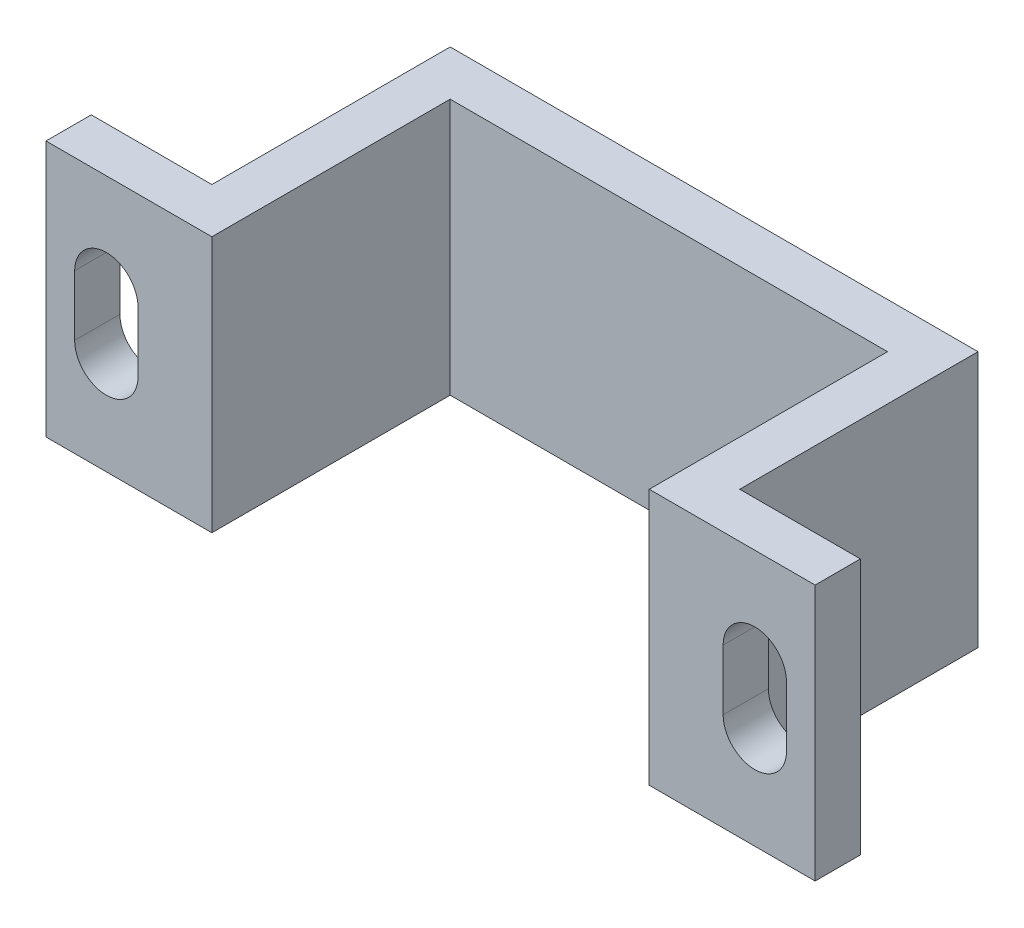
ISO-10303-21;
HEADER;
FILE_DESCRIPTION(('STEP AP214'),'2;1');
FILE_NAME('part.step','',(''),(''),'','','');
FILE_SCHEMA(('AUTOMOTIVE_DESIGN { 1 0 10303 214 1 1 1 1 }'));
ENDSEC;
DATA;
#1=APPLICATION_CONTEXT('core data for automotive mechanical design processes');
#2=APPLICATION_PROTOCOL_DEFINITION('international standard','automotive_design',2000,#1);
#3=PRODUCT_CONTEXT('',#1,'mechanical');
#4=PRODUCT('Part','Part','',(#3));
#5=PRODUCT_RELATED_PRODUCT_CATEGORY('part','',(#4));
#6=PRODUCT_DEFINITION_FORMATION('','',#4);
#7=PRODUCT_DEFINITION_CONTEXT('part definition',#1,'design');
#8=PRODUCT_DEFINITION('design','',#6,#7);
#9=PRODUCT_DEFINITION_SHAPE('','',#8);
#10=(LENGTH_UNIT() NAMED_UNIT(*) SI_UNIT(.MILLI.,.METRE.));
#11=(NAMED_UNIT(*) PLANE_ANGLE_UNIT() SI_UNIT($,.RADIAN.));
#12=(NAMED_UNIT(*) SI_UNIT($,.STERADIAN.) SOLID_ANGLE_UNIT());
#13=UNCERTAINTY_MEASURE_WITH_UNIT(LENGTH_MEASURE(1.E-05),#10,'distance_accuracy_value','');
#14=(GEOMETRIC_REPRESENTATION_CONTEXT(3) GLOBAL_UNCERTAINTY_ASSIGNED_CONTEXT((#13)) GLOBAL_UNIT_ASSIGNED_CONTEXT((#10,
#11,#12)) REPRESENTATION_CONTEXT('',''));
#15=CARTESIAN_POINT('',(0.,0.,0.));
#16=DIRECTION('',(0.,0.,1.));
#17=DIRECTION('',(1.,0.,0.));
#18=AXIS2_PLACEMENT_3D('',#15,#16,#17);
#19=CARTESIAN_POINT('',(54.61,21.59,-3.81));
#20=DIRECTION('',(0.,0.,-1.));
#21=DIRECTION('',(-1.,0.,0.));
#22=AXIS2_PLACEMENT_3D('',#19,#20,#21);
#23=PLANE('',#22);
#24=DIRECTION('',(1.,0.,0.));
#25=VECTOR('',#24,1.);
#26=CARTESIAN_POINT('',(54.61,0.,-3.81));
#27=LINE('',#26,#25);
#28=CARTESIAN_POINT('',(54.61,0.,-3.81));
#29=VERTEX_POINT('',#28);
#30=CARTESIAN_POINT('',(64.77,0.,-3.81));
#31=VERTEX_POINT('',#30);
#32=EDGE_CURVE('E255',#29,#31,#27,.T.);
#33=ORIENTED_EDGE('',*,*,#32,.F.);
#34=DIRECTION('',(0.,-1.,0.));
#35=VECTOR('',#34,1.);
#36=CARTESIAN_POINT('',(54.61,21.59,-3.81));
#37=LINE('',#36,#35);
#38=CARTESIAN_POINT('',(54.61,21.59,-3.81));
#39=VERTEX_POINT('',#38);
#40=EDGE_CURVE('E283',#39,#29,#37,.T.);
#41=ORIENTED_EDGE('',*,*,#40,.F.);
#42=DIRECTION('',(1.,0.,0.));
#43=VECTOR('',#42,1.);
#44=CARTESIAN_POINT('',(54.61,21.59,-3.81));
#45=LINE('',#44,#43);
#46=CARTESIAN_POINT('',(64.77,21.59,-3.81));
#47=VERTEX_POINT('',#46);
#48=EDGE_CURVE('E234',#39,#47,#45,.T.);
#49=ORIENTED_EDGE('',*,*,#48,.T.);
#50=DIRECTION('',(0.,-1.,0.));
#51=VECTOR('',#50,1.);
#52=CARTESIAN_POINT('',(64.77,21.59,-3.81));
#53=LINE('',#52,#51);
#54=EDGE_CURVE('E286',#47,#31,#53,.T.);
#55=ORIENTED_EDGE('',*,*,#54,.T.);
#56=EDGE_LOOP('',(#33,#41,#49,#55));
#57=FACE_BOUND('',#56,.T.);
#58=DIRECTION('',(0.,1.,0.));
#59=VECTOR('',#58,1.);
#60=CARTESIAN_POINT('',(62.357,13.335,-3.81));
#61=LINE('',#60,#59);
#62=CARTESIAN_POINT('',(62.357,8.255,-3.81));
#63=VERTEX_POINT('',#62);
#64=CARTESIAN_POINT('',(62.357,13.335,-3.81));
#65=VERTEX_POINT('',#64);
#66=EDGE_CURVE('E209',#63,#65,#61,.T.);
#67=ORIENTED_EDGE('',*,*,#66,.T.);
#68=CARTESIAN_POINT('',(59.69,13.335,-3.81));
#69=DIRECTION('',(0.,0.,1.));
#70=DIRECTION('',(1.,0.,0.));
#71=AXIS2_PLACEMENT_3D('',#68,#69,#70);
#72=CIRCLE('',#71,2.667);
#73=CARTESIAN_POINT('',(57.023,13.335,-3.81));
#74=VERTEX_POINT('',#73);
#75=EDGE_CURVE('E61',#65,#74,#72,.T.);
#76=ORIENTED_EDGE('',*,*,#75,.T.);
#77=DIRECTION('',(0.,-1.,0.));
#78=VECTOR('',#77,1.);
#79=CARTESIAN_POINT('',(57.023,13.335,-3.81));
#80=LINE('',#79,#78);
#81=CARTESIAN_POINT('',(57.023,8.255,-3.81));
#82=VERTEX_POINT('',#81);
#83=EDGE_CURVE('E192',#74,#82,#80,.T.);
#84=ORIENTED_EDGE('',*,*,#83,.T.);
#85=CARTESIAN_POINT('',(59.69,8.255,-3.81));
#86=DIRECTION('',(0.,0.,1.));
#87=DIRECTION('',(1.,0.,0.));
#88=AXIS2_PLACEMENT_3D('',#85,#86,#87);
#89=CIRCLE('',#88,2.667);
#90=EDGE_CURVE('E216',#82,#63,#89,.T.);
#91=ORIENTED_EDGE('',*,*,#90,.T.);
#92=EDGE_LOOP('',(#67,#76,#84,#91));
#93=FACE_BOUND('',#92,.T.);
#94=ADVANCED_FACE('F45',(#57,#93),#23,.T.);
#95=CARTESIAN_POINT('',(64.77,21.59,0.));
#96=DIRECTION('',(0.,0.,1.));
#97=DIRECTION('',(1.,0.,0.));
#98=AXIS2_PLACEMENT_3D('',#95,#96,#97);
#99=PLANE('',#98);
#100=DIRECTION('',(-1.,0.,0.));
#101=VECTOR('',#100,1.);
#102=CARTESIAN_POINT('',(64.77,0.,0.));
#103=LINE('',#102,#101);
#104=CARTESIAN_POINT('',(64.77,0.,0.));
#105=VERTEX_POINT('',#104);
#106=CARTESIAN_POINT('',(50.8,0.,0.));
#107=VERTEX_POINT('',#106);
#108=EDGE_CURVE('E235',#105,#107,#103,.T.);
#109=ORIENTED_EDGE('',*,*,#108,.F.);
#110=DIRECTION('',(0.,-1.,0.));
#111=VECTOR('',#110,1.);
#112=CARTESIAN_POINT('',(64.77,21.59,0.));
#113=LINE('',#112,#111);
#114=CARTESIAN_POINT('',(64.77,21.59,0.));
#115=VERTEX_POINT('',#114);
#116=EDGE_CURVE('E251',#115,#105,#113,.T.);
#117=ORIENTED_EDGE('',*,*,#116,.F.);
#118=DIRECTION('',(-1.,0.,0.));
#119=VECTOR('',#118,1.);
#120=CARTESIAN_POINT('',(64.77,21.59,0.));
#121=LINE('',#120,#119);
#122=CARTESIAN_POINT('',(50.8,21.59,0.));
#123=VERTEX_POINT('',#122);
#124=EDGE_CURVE('E247',#115,#123,#121,.T.);
#125=ORIENTED_EDGE('',*,*,#124,.T.);
#126=DIRECTION('',(0.,-1.,0.));
#127=VECTOR('',#126,1.);
#128=CARTESIAN_POINT('',(50.8,21.59,0.));
#129=LINE('',#128,#127);
#130=EDGE_CURVE('E272',#123,#107,#129,.T.);
#131=ORIENTED_EDGE('',*,*,#130,.T.);
#132=EDGE_LOOP('',(#109,#117,#125,#131));
#133=FACE_BOUND('',#132,.T.);
#134=DIRECTION('',(0.,-1.,0.));
#135=VECTOR('',#134,1.);
#136=CARTESIAN_POINT('',(57.023,13.335,0.));
#137=LINE('',#136,#135);
#138=CARTESIAN_POINT('',(57.023,13.335,0.));
#139=VERTEX_POINT('',#138);
#140=CARTESIAN_POINT('',(57.023,8.255,0.));
#141=VERTEX_POINT('',#140);
#142=EDGE_CURVE('E204',#139,#141,#137,.T.);
#143=ORIENTED_EDGE('',*,*,#142,.F.);
#144=CARTESIAN_POINT('',(59.69,13.335,0.));
#145=DIRECTION('',(0.,0.,1.));
#146=DIRECTION('',(1.,0.,0.));
#147=AXIS2_PLACEMENT_3D('',#144,#145,#146);
#148=CIRCLE('',#147,2.667);
#149=CARTESIAN_POINT('',(62.357,13.335,0.));
#150=VERTEX_POINT('',#149);
#151=EDGE_CURVE('E185',#150,#139,#148,.T.);
#152=ORIENTED_EDGE('',*,*,#151,.F.);
#153=DIRECTION('',(0.,1.,0.));
#154=VECTOR('',#153,1.);
#155=CARTESIAN_POINT('',(62.357,13.335,0.));
#156=LINE('',#155,#154);
#157=CARTESIAN_POINT('',(62.357,8.255,0.));
#158=VERTEX_POINT('',#157);
#159=EDGE_CURVE('E195',#158,#150,#156,.T.);
#160=ORIENTED_EDGE('',*,*,#159,.F.);
#161=CARTESIAN_POINT('',(59.69,8.255,0.));
#162=DIRECTION('',(0.,0.,1.));
#163=DIRECTION('',(1.,0.,0.));
#164=AXIS2_PLACEMENT_3D('',#161,#162,#163);
#165=CIRCLE('',#164,2.667);
#166=EDGE_CURVE('E69',#141,#158,#165,.T.);
#167=ORIENTED_EDGE('',*,*,#166,.F.);
#168=EDGE_LOOP('',(#143,#152,#160,#167));
#169=FACE_BOUND('',#168,.T.);
#170=ADVANCED_FACE('F202',(#133,#169),#99,.T.);
#171=CARTESIAN_POINT('',(0.,21.59,-3.81));
#172=DIRECTION('',(1.,0.,0.));
#173=DIRECTION('',(0.,0.,-1.));
#174=AXIS2_PLACEMENT_3D('',#171,#172,#173);
#175=PLANE('',#174);
#176=DIRECTION('',(0.,0.,1.));
#177=VECTOR('',#176,1.);
#178=CARTESIAN_POINT('',(0.,0.,-3.81));
#179=LINE('',#178,#177);
#180=CARTESIAN_POINT('',(0.,0.,-3.81));
#181=VERTEX_POINT('',#180);
#182=CARTESIAN_POINT('',(0.,0.,0.));
#183=VERTEX_POINT('',#182);
#184=EDGE_CURVE('E332',#181,#183,#179,.T.);
#185=ORIENTED_EDGE('',*,*,#184,.T.);
#186=DIRECTION('',(0.,-1.,0.));
#187=VECTOR('',#186,1.);
#188=CARTESIAN_POINT('',(0.,21.59,0.));
#189=LINE('',#188,#187);
#190=CARTESIAN_POINT('',(0.,21.59,0.));
#191=VERTEX_POINT('',#190);
#192=EDGE_CURVE('E11',#191,#183,#189,.T.);
#193=ORIENTED_EDGE('',*,*,#192,.F.);
#194=DIRECTION('',(0.,0.,1.));
#195=VECTOR('',#194,1.);
#196=CARTESIAN_POINT('',(0.,21.59,-3.81));
#197=LINE('',#196,#195);
#198=CARTESIAN_POINT('',(0.,21.59,-3.81));
#199=VERTEX_POINT('',#198);
#200=EDGE_CURVE('E333',#199,#191,#197,.T.);
#201=ORIENTED_EDGE('',*,*,#200,.F.);
#202=DIRECTION('',(0.,-1.,0.));
#203=VECTOR('',#202,1.);
#204=CARTESIAN_POINT('',(0.,21.59,-3.81));
#205=LINE('',#204,#203);
#206=EDGE_CURVE('E356',#199,#181,#205,.T.);
#207=ORIENTED_EDGE('',*,*,#206,.T.);
#208=EDGE_LOOP('',(#185,#193,#201,#207));
#209=FACE_BOUND('',#208,.T.);
#210=ADVANCED_FACE('F47',(#209),#175,.F.);
#211=CARTESIAN_POINT('',(0.,21.59,0.));
#212=DIRECTION('',(0.,0.,-1.));
#213=DIRECTION('',(-1.,0.,0.));
#214=AXIS2_PLACEMENT_3D('',#211,#212,#213);
#215=PLANE('',#214);
#216=DIRECTION('',(0.,-1.,0.));
#217=VECTOR('',#216,1.);
#218=CARTESIAN_POINT('',(2.413,13.335,0.));
#219=LINE('',#218,#217);
#220=CARTESIAN_POINT('',(2.413,13.335,0.));
#221=VERTEX_POINT('',#220);
#222=CARTESIAN_POINT('',(2.413,8.255,0.));
#223=VERTEX_POINT('',#222);
#224=EDGE_CURVE('E292',#221,#223,#219,.T.);
#225=ORIENTED_EDGE('',*,*,#224,.F.);
#226=CARTESIAN_POINT('',(5.08,13.335,0.));
#227=DIRECTION('',(0.,0.,-1.));
#228=DIRECTION('',(-1.,0.,0.));
#229=AXIS2_PLACEMENT_3D('',#226,#227,#228);
#230=CIRCLE('',#229,2.667);
#231=CARTESIAN_POINT('',(7.747,13.335,0.));
#232=VERTEX_POINT('',#231);
#233=EDGE_CURVE('E296',#232,#221,#230,.F.);
#234=ORIENTED_EDGE('',*,*,#233,.F.);
#235=DIRECTION('',(0.,1.,0.));
#236=VECTOR('',#235,1.);
#237=CARTESIAN_POINT('',(7.747,13.335,0.));
#238=LINE('',#237,#236);
#239=CARTESIAN_POINT('',(7.747,8.255,0.));
#240=VERTEX_POINT('',#239);
#241=EDGE_CURVE('E319',#240,#232,#238,.T.);
#242=ORIENTED_EDGE('',*,*,#241,.F.);
#243=CARTESIAN_POINT('',(5.08,8.255,0.));
#244=DIRECTION('',(0.,0.,-1.));
#245=DIRECTION('',(-1.,0.,0.));
#246=AXIS2_PLACEMENT_3D('',#243,#244,#245);
#247=CIRCLE('',#246,2.667);
#248=EDGE_CURVE('E289',#223,#240,#247,.F.);
#249=ORIENTED_EDGE('',*,*,#248,.F.);
#250=EDGE_LOOP('',(#225,#234,#242,#249));
#251=FACE_BOUND('',#250,.T.);
#252=DIRECTION('',(1.,0.,0.));
#253=VECTOR('',#252,1.);
#254=CARTESIAN_POINT('',(0.,0.,0.));
#255=LINE('',#254,#253);
#256=CARTESIAN_POINT('',(13.97,0.,0.));
#257=VERTEX_POINT('',#256);
#258=EDGE_CURVE('E360',#183,#257,#255,.T.);
#259=ORIENTED_EDGE('',*,*,#258,.T.);
#260=DIRECTION('',(0.,-1.,0.));
#261=VECTOR('',#260,1.);
#262=CARTESIAN_POINT('',(13.97,21.59,0.));
#263=LINE('',#262,#261);
#264=CARTESIAN_POINT('',(13.97,21.59,0.));
#265=VERTEX_POINT('',#264);
#266=EDGE_CURVE('E54',#265,#257,#263,.T.);
#267=ORIENTED_EDGE('',*,*,#266,.F.);
#268=DIRECTION('',(1.,0.,0.));
#269=VECTOR('',#268,1.);
#270=CARTESIAN_POINT('',(0.,21.59,0.));
#271=LINE('',#270,#269);
#272=EDGE_CURVE('E337',#191,#265,#271,.T.);
#273=ORIENTED_EDGE('',*,*,#272,.F.);
#274=ORIENTED_EDGE('',*,*,#192,.T.);
#275=EDGE_LOOP('',(#259,#267,#273,#274));
#276=FACE_BOUND('',#275,.T.);
#277=ADVANCED_FACE('F446',(#251,#276),#215,.F.);
#278=CARTESIAN_POINT('',(13.97,21.59,0.));
#279=DIRECTION('',(-1.,0.,0.));
#280=DIRECTION('',(0.,0.,1.));
#281=AXIS2_PLACEMENT_3D('',#278,#279,#280);
#282=PLANE('',#281);
#283=DIRECTION('',(0.,0.,-1.));
#284=VECTOR('',#283,1.);
#285=CARTESIAN_POINT('',(13.97,0.,0.));
#286=LINE('',#285,#284);
#287=CARTESIAN_POINT('',(13.97,0.,-20.066));
#288=VERTEX_POINT('',#287);
#289=EDGE_CURVE('E363',#257,#288,#286,.T.);
#290=ORIENTED_EDGE('',*,*,#289,.T.);
#291=DIRECTION('',(0.,-1.,0.));
#292=VECTOR('',#291,1.);
#293=CARTESIAN_POINT('',(13.97,21.59,-20.066));
#294=LINE('',#293,#292);
#295=CARTESIAN_POINT('',(13.97,21.59,-20.066));
#296=VERTEX_POINT('',#295);
#297=EDGE_CURVE('E388',#296,#288,#294,.T.);
#298=ORIENTED_EDGE('',*,*,#297,.F.);
#299=DIRECTION('',(0.,0.,-1.));
#300=VECTOR('',#299,1.);
#301=CARTESIAN_POINT('',(13.97,21.59,0.));
#302=LINE('',#301,#300);
#303=EDGE_CURVE('E341',#265,#296,#302,.T.);
#304=ORIENTED_EDGE('',*,*,#303,.F.);
#305=ORIENTED_EDGE('',*,*,#266,.T.);
#306=EDGE_LOOP('',(#290,#298,#304,#305));
#307=FACE_BOUND('',#306,.T.);
#308=ADVANCED_FACE('F397',(#307),#282,.F.);
#309=CARTESIAN_POINT('',(13.97,21.59,-20.066));
#310=DIRECTION('',(0.,0.,-1.));
#311=DIRECTION('',(-1.,0.,0.));
#312=AXIS2_PLACEMENT_3D('',#309,#310,#311);
#313=PLANE('',#312);
#314=DIRECTION('',(1.,0.,0.));
#315=VECTOR('',#314,1.);
#316=CARTESIAN_POINT('',(13.97,0.,-20.066));
#317=LINE('',#316,#315);
#318=CARTESIAN_POINT('',(50.8,0.,-20.066));
#319=VERTEX_POINT('',#318);
#320=EDGE_CURVE('E366',#288,#319,#317,.T.);
#321=ORIENTED_EDGE('',*,*,#320,.T.);
#322=DIRECTION('',(0.,-1.,0.));
#323=VECTOR('',#322,1.);
#324=CARTESIAN_POINT('',(50.8,21.59,-20.066));
#325=LINE('',#324,#323);
#326=CARTESIAN_POINT('',(50.8,21.59,-20.066));
#327=VERTEX_POINT('',#326);
#328=EDGE_CURVE('E275',#327,#319,#325,.T.);
#329=ORIENTED_EDGE('',*,*,#328,.F.);
#330=DIRECTION('',(1.,0.,0.));
#331=VECTOR('',#330,1.);
#332=CARTESIAN_POINT('',(13.97,21.59,-20.066));
#333=LINE('',#332,#331);
#334=EDGE_CURVE('E344',#296,#327,#333,.T.);
#335=ORIENTED_EDGE('',*,*,#334,.F.);
#336=ORIENTED_EDGE('',*,*,#297,.T.);
#337=EDGE_LOOP('',(#321,#329,#335,#336));
#338=FACE_BOUND('',#337,.T.);
#339=ADVANCED_FACE('F407',(#338),#313,.F.);
#340=CARTESIAN_POINT('',(32.385,21.59,-23.876));
#341=DIRECTION('',(0.,0.,1.));
#342=DIRECTION('',(1.,0.,0.));
#343=AXIS2_PLACEMENT_3D('',#340,#341,#342);
#344=PLANE('',#343);
#345=DIRECTION('',(-1.,0.,0.));
#346=VECTOR('',#345,1.);
#347=CARTESIAN_POINT('',(32.385,0.,-23.876));
#348=LINE('',#347,#346);
#349=CARTESIAN_POINT('',(54.61,0.,-23.876));
#350=VERTEX_POINT('',#349);
#351=CARTESIAN_POINT('',(10.16,0.,-23.876));
#352=VERTEX_POINT('',#351);
#353=EDGE_CURVE('E369',#350,#352,#348,.T.);
#354=ORIENTED_EDGE('',*,*,#353,.T.);
#355=DIRECTION('',(0.,-1.,0.));
#356=VECTOR('',#355,1.);
#357=CARTESIAN_POINT('',(10.16,21.59,-23.876));
#358=LINE('',#357,#356);
#359=CARTESIAN_POINT('',(10.16,21.59,-23.876));
#360=VERTEX_POINT('',#359);
#361=EDGE_CURVE('E384',#360,#352,#358,.T.);
#362=ORIENTED_EDGE('',*,*,#361,.F.);
#363=DIRECTION('',(-1.,0.,0.));
#364=VECTOR('',#363,1.);
#365=CARTESIAN_POINT('',(32.385,21.59,-23.876));
#366=LINE('',#365,#364);
#367=CARTESIAN_POINT('',(54.61,21.59,-23.876));
#368=VERTEX_POINT('',#367);
#369=EDGE_CURVE('E347',#368,#360,#366,.T.);
#370=ORIENTED_EDGE('',*,*,#369,.F.);
#371=DIRECTION('',(0.,-1.,0.));
#372=VECTOR('',#371,1.);
#373=CARTESIAN_POINT('',(54.61,21.59,-23.876));
#374=LINE('',#373,#372);
#375=EDGE_CURVE('E279',#368,#350,#374,.T.);
#376=ORIENTED_EDGE('',*,*,#375,.T.);
#377=EDGE_LOOP('',(#354,#362,#370,#376));
#378=FACE_BOUND('',#377,.T.);
#379=ADVANCED_FACE('F434',(#378),#344,.F.);
#380=CARTESIAN_POINT('',(10.16,21.59,-23.876));
#381=DIRECTION('',(1.,0.,0.));
#382=DIRECTION('',(0.,0.,-1.));
#383=AXIS2_PLACEMENT_3D('',#380,#381,#382);
#384=PLANE('',#383);
#385=DIRECTION('',(0.,0.,1.));
#386=VECTOR('',#385,1.);
#387=CARTESIAN_POINT('',(10.16,0.,-23.876));
#388=LINE('',#387,#386);
#389=CARTESIAN_POINT('',(10.16,0.,-3.81));
#390=VERTEX_POINT('',#389);
#391=EDGE_CURVE('E372',#352,#390,#388,.T.);
#392=ORIENTED_EDGE('',*,*,#391,.T.);
#393=DIRECTION('',(0.,-1.,0.));
#394=VECTOR('',#393,1.);
#395=CARTESIAN_POINT('',(10.16,21.59,-3.81));
#396=LINE('',#395,#394);
#397=CARTESIAN_POINT('',(10.16,21.59,-3.81));
#398=VERTEX_POINT('',#397);
#399=EDGE_CURVE('E380',#398,#390,#396,.T.);
#400=ORIENTED_EDGE('',*,*,#399,.F.);
#401=DIRECTION('',(0.,0.,1.));
#402=VECTOR('',#401,1.);
#403=CARTESIAN_POINT('',(10.16,21.59,-23.876));
#404=LINE('',#403,#402);
#405=EDGE_CURVE('E350',#360,#398,#404,.T.);
#406=ORIENTED_EDGE('',*,*,#405,.F.);
#407=ORIENTED_EDGE('',*,*,#361,.T.);
#408=EDGE_LOOP('',(#392,#400,#406,#407));
#409=FACE_BOUND('',#408,.T.);
#410=ADVANCED_FACE('F437',(#409),#384,.F.);
#411=CARTESIAN_POINT('',(10.16,21.59,-3.81));
#412=DIRECTION('',(0.,0.,1.));
#413=DIRECTION('',(1.,0.,0.));
#414=AXIS2_PLACEMENT_3D('',#411,#412,#413);
#415=PLANE('',#414);
#416=DIRECTION('',(0.,-1.,0.));
#417=VECTOR('',#416,1.);
#418=CARTESIAN_POINT('',(7.747,13.335,-3.81));
#419=LINE('',#418,#417);
#420=CARTESIAN_POINT('',(7.747,13.335,-3.81));
#421=VERTEX_POINT('',#420);
#422=CARTESIAN_POINT('',(7.747,8.255,-3.81));
#423=VERTEX_POINT('',#422);
#424=EDGE_CURVE('E303',#421,#423,#419,.T.);
#425=ORIENTED_EDGE('',*,*,#424,.F.);
#426=CARTESIAN_POINT('',(5.08,13.335,-3.81));
#427=DIRECTION('',(0.,0.,-1.));
#428=DIRECTION('',(-1.,0.,0.));
#429=AXIS2_PLACEMENT_3D('',#426,#427,#428);
#430=CIRCLE('',#429,2.667);
#431=CARTESIAN_POINT('',(2.413,13.335,-3.81));
#432=VERTEX_POINT('',#431);
#433=EDGE_CURVE('E300',#432,#421,#430,.T.);
#434=ORIENTED_EDGE('',*,*,#433,.F.);
#435=DIRECTION('',(0.,1.,0.));
#436=VECTOR('',#435,1.);
#437=CARTESIAN_POINT('',(2.413,13.335,-3.81));
#438=LINE('',#437,#436);
#439=CARTESIAN_POINT('',(2.413,8.255,-3.81));
#440=VERTEX_POINT('',#439);
#441=EDGE_CURVE('E311',#440,#432,#438,.T.);
#442=ORIENTED_EDGE('',*,*,#441,.F.);
#443=CARTESIAN_POINT('',(5.08,8.255,-3.81));
#444=DIRECTION('',(0.,0.,-1.));
#445=DIRECTION('',(-1.,0.,0.));
#446=AXIS2_PLACEMENT_3D('',#443,#444,#445);
#447=CIRCLE('',#446,2.667);
#448=EDGE_CURVE('E307',#423,#440,#447,.T.);
#449=ORIENTED_EDGE('',*,*,#448,.F.);
#450=EDGE_LOOP('',(#425,#434,#442,#449));
#451=FACE_BOUND('',#450,.T.);
#452=DIRECTION('',(-1.,0.,0.));
#453=VECTOR('',#452,1.);
#454=CARTESIAN_POINT('',(10.16,0.,-3.81));
#455=LINE('',#454,#453);
#456=EDGE_CURVE('E338',#390,#181,#455,.T.);
#457=ORIENTED_EDGE('',*,*,#456,.T.);
#458=ORIENTED_EDGE('',*,*,#206,.F.);
#459=DIRECTION('',(-1.,0.,0.));
#460=VECTOR('',#459,1.);
#461=CARTESIAN_POINT('',(10.16,21.59,-3.81));
#462=LINE('',#461,#460);
#463=EDGE_CURVE('E353',#398,#199,#462,.T.);
#464=ORIENTED_EDGE('',*,*,#463,.F.);
#465=ORIENTED_EDGE('',*,*,#399,.T.);
#466=EDGE_LOOP('',(#457,#458,#464,#465));
#467=FACE_BOUND('',#466,.T.);
#468=ADVANCED_FACE('F442',(#451,#467),#415,.F.);
#469=CARTESIAN_POINT('',(0.,21.59,0.));
#470=DIRECTION('',(0.,1.,0.));
#471=DIRECTION('',(0.,0.,1.));
#472=AXIS2_PLACEMENT_3D('',#469,#470,#471);
#473=PLANE('',#472);
#474=ORIENTED_EDGE('',*,*,#200,.T.);
#475=ORIENTED_EDGE('',*,*,#272,.T.);
#476=ORIENTED_EDGE('',*,*,#303,.T.);
#477=ORIENTED_EDGE('',*,*,#334,.T.);
#478=DIRECTION('',(0.,0.,-1.));
#479=VECTOR('',#478,1.);
#480=CARTESIAN_POINT('',(50.8,21.59,0.));
#481=LINE('',#480,#479);
#482=EDGE_CURVE('E243',#123,#327,#481,.T.);
#483=ORIENTED_EDGE('',*,*,#482,.F.);
#484=ORIENTED_EDGE('',*,*,#124,.F.);
#485=DIRECTION('',(0.,0.,1.));
#486=VECTOR('',#485,1.);
#487=CARTESIAN_POINT('',(64.77,21.59,-3.81));
#488=LINE('',#487,#486);
#489=EDGE_CURVE('E230',#47,#115,#488,.T.);
#490=ORIENTED_EDGE('',*,*,#489,.F.);
#491=ORIENTED_EDGE('',*,*,#48,.F.);
#492=DIRECTION('',(0.,0.,1.));
#493=VECTOR('',#492,1.);
#494=CARTESIAN_POINT('',(54.61,21.59,-23.876));
#495=LINE('',#494,#493);
#496=EDGE_CURVE('E239',#368,#39,#495,.T.);
#497=ORIENTED_EDGE('',*,*,#496,.F.);
#498=ORIENTED_EDGE('',*,*,#369,.T.);
#499=ORIENTED_EDGE('',*,*,#405,.T.);
#500=ORIENTED_EDGE('',*,*,#463,.T.);
#501=EDGE_LOOP('',(#474,#475,#476,#477,#483,#484,#490,#491,#497,#498,#499,#500));
#502=FACE_BOUND('',#501,.T.);
#503=ADVANCED_FACE('F414',(#502),#473,.T.);
#504=CARTESIAN_POINT('',(0.,0.,0.));
#505=DIRECTION('',(0.,1.,0.));
#506=DIRECTION('',(0.,0.,1.));
#507=AXIS2_PLACEMENT_3D('',#504,#505,#506);
#508=PLANE('',#507);
#509=ORIENTED_EDGE('',*,*,#184,.F.);
#510=ORIENTED_EDGE('',*,*,#456,.F.);
#511=ORIENTED_EDGE('',*,*,#391,.F.);
#512=ORIENTED_EDGE('',*,*,#353,.F.);
#513=DIRECTION('',(0.,0.,1.));
#514=VECTOR('',#513,1.);
#515=CARTESIAN_POINT('',(54.61,0.,-23.876));
#516=LINE('',#515,#514);
#517=EDGE_CURVE('E259',#350,#29,#516,.T.);
#518=ORIENTED_EDGE('',*,*,#517,.T.);
#519=ORIENTED_EDGE('',*,*,#32,.T.);
#520=DIRECTION('',(0.,0.,1.));
#521=VECTOR('',#520,1.);
#522=CARTESIAN_POINT('',(64.77,0.,-3.81));
#523=LINE('',#522,#521);
#524=EDGE_CURVE('E199',#31,#105,#523,.T.);
#525=ORIENTED_EDGE('',*,*,#524,.T.);
#526=ORIENTED_EDGE('',*,*,#108,.T.);
#527=DIRECTION('',(0.,0.,-1.));
#528=VECTOR('',#527,1.);
#529=CARTESIAN_POINT('',(50.8,0.,0.));
#530=LINE('',#529,#528);
#531=EDGE_CURVE('E263',#107,#319,#530,.T.);
#532=ORIENTED_EDGE('',*,*,#531,.T.);
#533=ORIENTED_EDGE('',*,*,#320,.F.);
#534=ORIENTED_EDGE('',*,*,#289,.F.);
#535=ORIENTED_EDGE('',*,*,#258,.F.);
#536=EDGE_LOOP('',(#509,#510,#511,#512,#518,#519,#525,#526,#532,#533,#534,#535));
#537=FACE_BOUND('',#536,.T.);
#538=ADVANCED_FACE('F403',(#537),#508,.F.);
#539=CARTESIAN_POINT('',(5.08,13.335,0.0010000000000049));
#540=DIRECTION('',(0.,0.,-1.));
#541=DIRECTION('',(-1.,0.,0.));
#542=AXIS2_PLACEMENT_3D('',#539,#540,#541);
#543=CYLINDRICAL_SURFACE('',#542,2.667);
#544=ORIENTED_EDGE('',*,*,#233,.T.);
#545=DIRECTION('',(0.,0.,-1.));
#546=VECTOR('',#545,1.);
#547=CARTESIAN_POINT('',(2.413,13.335,0.00100000000000534));
#548=LINE('',#547,#546);
#549=EDGE_CURVE('E316',#221,#432,#548,.T.);
#550=ORIENTED_EDGE('',*,*,#549,.T.);
#551=ORIENTED_EDGE('',*,*,#433,.T.);
#552=DIRECTION('',(0.,0.,-1.));
#553=VECTOR('',#552,1.);
#554=CARTESIAN_POINT('',(7.747,13.335,0.00100000000000447));
#555=LINE('',#554,#553);
#556=EDGE_CURVE('E315',#232,#421,#555,.T.);
#557=ORIENTED_EDGE('',*,*,#556,.F.);
#558=EDGE_LOOP('',(#544,#550,#551,#557));
#559=FACE_BOUND('',#558,.T.);
#560=ADVANCED_FACE('F474',(#559),#543,.F.);
#561=CARTESIAN_POINT('',(2.413,13.335,0.00100000000000534));
#562=DIRECTION('',(-1.,0.,0.));
#563=DIRECTION('',(0.,-1.,0.));
#564=AXIS2_PLACEMENT_3D('',#561,#562,#563);
#565=PLANE('',#564);
#566=ORIENTED_EDGE('',*,*,#224,.T.);
#567=DIRECTION('',(0.,0.,-1.));
#568=VECTOR('',#567,1.);
#569=CARTESIAN_POINT('',(2.413,8.255,0.00100000000000534));
#570=LINE('',#569,#568);
#571=EDGE_CURVE('E320',#223,#440,#570,.T.);
#572=ORIENTED_EDGE('',*,*,#571,.T.);
#573=ORIENTED_EDGE('',*,*,#441,.T.);
#574=ORIENTED_EDGE('',*,*,#549,.F.);
#575=EDGE_LOOP('',(#566,#572,#573,#574));
#576=FACE_BOUND('',#575,.T.);
#577=ADVANCED_FACE('F470',(#576),#565,.F.);
#578=CARTESIAN_POINT('',(5.08,8.255,0.0010000000000049));
#579=DIRECTION('',(0.,0.,-1.));
#580=DIRECTION('',(-1.,0.,0.));
#581=AXIS2_PLACEMENT_3D('',#578,#579,#580);
#582=CYLINDRICAL_SURFACE('',#581,2.667);
#583=ORIENTED_EDGE('',*,*,#248,.T.);
#584=DIRECTION('',(0.,0.,-1.));
#585=VECTOR('',#584,1.);
#586=CARTESIAN_POINT('',(7.747,8.255,0.00100000000000447));
#587=LINE('',#586,#585);
#588=EDGE_CURVE('E323',#240,#423,#587,.T.);
#589=ORIENTED_EDGE('',*,*,#588,.T.);
#590=ORIENTED_EDGE('',*,*,#448,.T.);
#591=ORIENTED_EDGE('',*,*,#571,.F.);
#592=EDGE_LOOP('',(#583,#589,#590,#591));
#593=FACE_BOUND('',#592,.T.);
#594=ADVANCED_FACE('F473',(#593),#582,.F.);
#595=CARTESIAN_POINT('',(7.747,13.335,0.00100000000000447));
#596=DIRECTION('',(1.,0.,0.));
#597=DIRECTION('',(0.,1.,0.));
#598=AXIS2_PLACEMENT_3D('',#595,#596,#597);
#599=PLANE('',#598);
#600=ORIENTED_EDGE('',*,*,#241,.T.);
#601=ORIENTED_EDGE('',*,*,#556,.T.);
#602=ORIENTED_EDGE('',*,*,#424,.T.);
#603=ORIENTED_EDGE('',*,*,#588,.F.);
#604=EDGE_LOOP('',(#600,#601,#602,#603));
#605=FACE_BOUND('',#604,.T.);
#606=ADVANCED_FACE('F469',(#605),#599,.F.);
#607=CARTESIAN_POINT('',(64.77,21.59,-3.81));
#608=DIRECTION('',(1.,0.,0.));
#609=DIRECTION('',(0.,0.,-1.));
#610=AXIS2_PLACEMENT_3D('',#607,#608,#609);
#611=PLANE('',#610);
#612=ORIENTED_EDGE('',*,*,#524,.F.);
#613=ORIENTED_EDGE('',*,*,#54,.F.);
#614=ORIENTED_EDGE('',*,*,#489,.T.);
#615=ORIENTED_EDGE('',*,*,#116,.T.);
#616=EDGE_LOOP('',(#612,#613,#614,#615));
#617=FACE_BOUND('',#616,.T.);
#618=ADVANCED_FACE('F420',(#617),#611,.T.);
#619=CARTESIAN_POINT('',(54.61,21.59,-23.876));
#620=DIRECTION('',(1.,0.,0.));
#621=DIRECTION('',(0.,0.,-1.));
#622=AXIS2_PLACEMENT_3D('',#619,#620,#621);
#623=PLANE('',#622);
#624=ORIENTED_EDGE('',*,*,#517,.F.);
#625=ORIENTED_EDGE('',*,*,#375,.F.);
#626=ORIENTED_EDGE('',*,*,#496,.T.);
#627=ORIENTED_EDGE('',*,*,#40,.T.);
#628=EDGE_LOOP('',(#624,#625,#626,#627));
#629=FACE_BOUND('',#628,.T.);
#630=ADVANCED_FACE('F428',(#629),#623,.T.);
#631=CARTESIAN_POINT('',(50.8,21.59,0.));
#632=DIRECTION('',(-1.,0.,0.));
#633=DIRECTION('',(0.,0.,1.));
#634=AXIS2_PLACEMENT_3D('',#631,#632,#633);
#635=PLANE('',#634);
#636=ORIENTED_EDGE('',*,*,#531,.F.);
#637=ORIENTED_EDGE('',*,*,#130,.F.);
#638=ORIENTED_EDGE('',*,*,#482,.T.);
#639=ORIENTED_EDGE('',*,*,#328,.T.);
#640=EDGE_LOOP('',(#636,#637,#638,#639));
#641=FACE_BOUND('',#640,.T.);
#642=ADVANCED_FACE('F410',(#641),#635,.T.);
#643=CARTESIAN_POINT('',(59.69,13.335,0.00100000000001054));
#644=DIRECTION('',(0.,0.,-1.));
#645=DIRECTION('',(-1.,0.,0.));
#646=AXIS2_PLACEMENT_3D('',#643,#644,#645);
#647=CYLINDRICAL_SURFACE('',#646,2.667);
#648=ORIENTED_EDGE('',*,*,#151,.T.);
#649=DIRECTION('',(0.,0.,-1.));
#650=VECTOR('',#649,1.);
#651=CARTESIAN_POINT('',(57.023,13.335,0.00100000000001011));
#652=LINE('',#651,#650);
#653=EDGE_CURVE('E200',#139,#74,#652,.T.);
#654=ORIENTED_EDGE('',*,*,#653,.T.);
#655=ORIENTED_EDGE('',*,*,#75,.F.);
#656=DIRECTION('',(0.,0.,-1.));
#657=VECTOR('',#656,1.);
#658=CARTESIAN_POINT('',(62.357,13.335,0.00100000000001097));
#659=LINE('',#658,#657);
#660=EDGE_CURVE('E181',#150,#65,#659,.T.);
#661=ORIENTED_EDGE('',*,*,#660,.F.);
#662=EDGE_LOOP('',(#648,#654,#655,#661));
#663=FACE_BOUND('',#662,.T.);
#664=ADVANCED_FACE('F183',(#663),#647,.F.);
#665=CARTESIAN_POINT('',(57.023,13.335,0.00100000000001011));
#666=DIRECTION('',(1.,0.,0.));
#667=DIRECTION('',(0.,1.,0.));
#668=AXIS2_PLACEMENT_3D('',#665,#666,#667);
#669=PLANE('',#668);
#670=ORIENTED_EDGE('',*,*,#142,.T.);
#671=DIRECTION('',(0.,0.,-1.));
#672=VECTOR('',#671,1.);
#673=CARTESIAN_POINT('',(57.023,8.255,0.00100000000001011));
#674=LINE('',#673,#672);
#675=EDGE_CURVE('E225',#141,#82,#674,.T.);
#676=ORIENTED_EDGE('',*,*,#675,.T.);
#677=ORIENTED_EDGE('',*,*,#83,.F.);
#678=ORIENTED_EDGE('',*,*,#653,.F.);
#679=EDGE_LOOP('',(#670,#676,#677,#678));
#680=FACE_BOUND('',#679,.T.);
#681=ADVANCED_FACE('F539',(#680),#669,.T.);
#682=CARTESIAN_POINT('',(59.69,8.255,0.00100000000001054));
#683=DIRECTION('',(0.,0.,-1.));
#684=DIRECTION('',(-1.,0.,0.));
#685=AXIS2_PLACEMENT_3D('',#682,#683,#684);
#686=CYLINDRICAL_SURFACE('',#685,2.667);
#687=ORIENTED_EDGE('',*,*,#166,.T.);
#688=DIRECTION('',(0.,0.,-1.));
#689=VECTOR('',#688,1.);
#690=CARTESIAN_POINT('',(62.357,8.255,0.00100000000001097));
#691=LINE('',#690,#689);
#692=EDGE_CURVE('E191',#158,#63,#691,.T.);
#693=ORIENTED_EDGE('',*,*,#692,.T.);
#694=ORIENTED_EDGE('',*,*,#90,.F.);
#695=ORIENTED_EDGE('',*,*,#675,.F.);
#696=EDGE_LOOP('',(#687,#693,#694,#695));
#697=FACE_BOUND('',#696,.T.);
#698=ADVANCED_FACE('F548',(#697),#686,.F.);
#699=CARTESIAN_POINT('',(62.357,13.335,0.00100000000001097));
#700=DIRECTION('',(-1.,0.,0.));
#701=DIRECTION('',(0.,-1.,0.));
#702=AXIS2_PLACEMENT_3D('',#699,#700,#701);
#703=PLANE('',#702);
#704=ORIENTED_EDGE('',*,*,#159,.T.);
#705=ORIENTED_EDGE('',*,*,#660,.T.);
#706=ORIENTED_EDGE('',*,*,#66,.F.);
#707=ORIENTED_EDGE('',*,*,#692,.F.);
#708=EDGE_LOOP('',(#704,#705,#706,#707));
#709=FACE_BOUND('',#708,.T.);
#710=ADVANCED_FACE('F196',(#709),#703,.T.);
#711=CLOSED_SHELL('',(#94,#170,#210,#277,#308,#339,#379,#410,#468,#503,#538,#560,#577,#594,#606,
#618,#630,#642,#664,#681,#698,#710));
#712=MANIFOLD_SOLID_BREP('B2',#711);
#713=ADVANCED_BREP_SHAPE_REPRESENTATION('',(#18,#712),#14);
#714=SHAPE_DEFINITION_REPRESENTATION(#9,#713);
ENDSEC;
END-ISO-10303-21;
